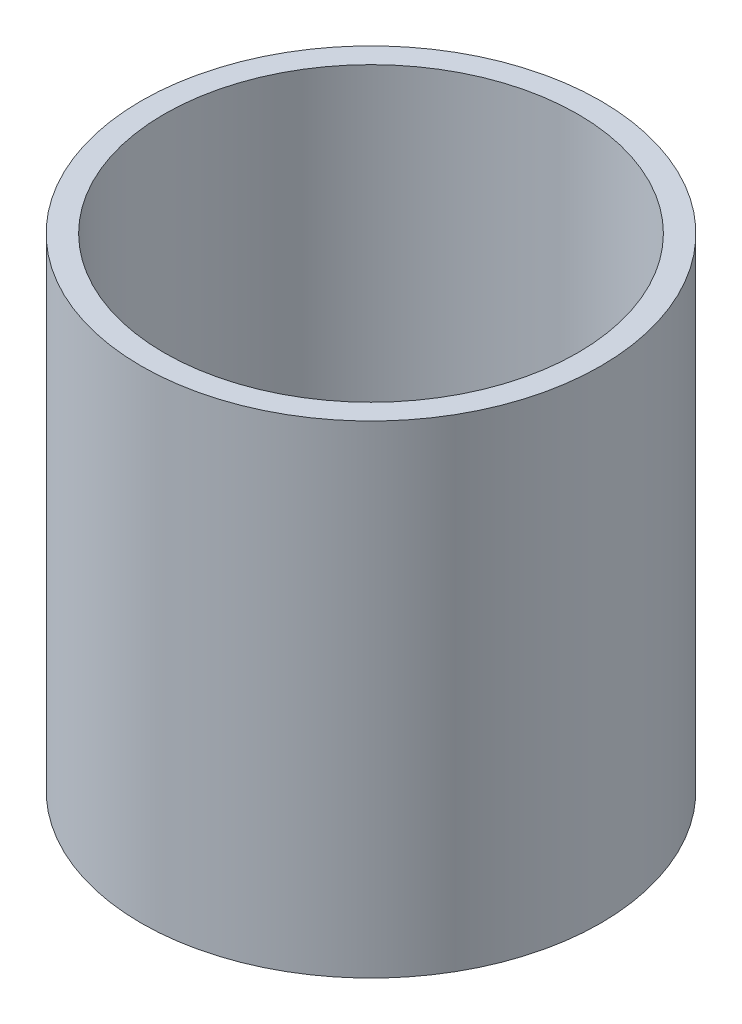
ISO-10303-21;
HEADER;
FILE_DESCRIPTION(('STEP AP214'),'2;1');
FILE_NAME('part.step','',(''),(''),'','','');
FILE_SCHEMA(('AUTOMOTIVE_DESIGN { 1 0 10303 214 1 1 1 1 }'));
ENDSEC;
DATA;
#1=APPLICATION_CONTEXT('core data for automotive mechanical design processes');
#2=APPLICATION_PROTOCOL_DEFINITION('international standard','automotive_design',2000,#1);
#3=PRODUCT_CONTEXT('',#1,'mechanical');
#4=PRODUCT('Part','Part','',(#3));
#5=PRODUCT_RELATED_PRODUCT_CATEGORY('part','',(#4));
#6=PRODUCT_DEFINITION_FORMATION('','',#4);
#7=PRODUCT_DEFINITION_CONTEXT('part definition',#1,'design');
#8=PRODUCT_DEFINITION('design','',#6,#7);
#9=PRODUCT_DEFINITION_SHAPE('','',#8);
#10=(LENGTH_UNIT() NAMED_UNIT(*) SI_UNIT(.MILLI.,.METRE.));
#11=(NAMED_UNIT(*) PLANE_ANGLE_UNIT() SI_UNIT($,.RADIAN.));
#12=(NAMED_UNIT(*) SI_UNIT($,.STERADIAN.) SOLID_ANGLE_UNIT());
#13=UNCERTAINTY_MEASURE_WITH_UNIT(LENGTH_MEASURE(1.E-05),#10,'distance_accuracy_value','');
#14=(GEOMETRIC_REPRESENTATION_CONTEXT(3) GLOBAL_UNCERTAINTY_ASSIGNED_CONTEXT((#13)) GLOBAL_UNIT_ASSIGNED_CONTEXT((#10,
#11,#12)) REPRESENTATION_CONTEXT('',''));
#15=CARTESIAN_POINT('',(0.,0.,0.));
#16=DIRECTION('',(0.,0.,1.));
#17=DIRECTION('',(1.,0.,0.));
#18=AXIS2_PLACEMENT_3D('',#15,#16,#17);
#19=CARTESIAN_POINT('',(0.,21.,0.));
#20=DIRECTION('',(0.,1.,0.));
#21=DIRECTION('',(0.,0.,1.));
#22=AXIS2_PLACEMENT_3D('',#19,#20,#21);
#23=PLANE('',#22);
#24=CARTESIAN_POINT('',(0.,21.,0.));
#25=DIRECTION('',(0.,1.,0.));
#26=DIRECTION('',(0.,0.,1.));
#27=AXIS2_PLACEMENT_3D('',#24,#25,#26);
#28=CIRCLE('',#27,10.);
#29=CARTESIAN_POINT('',(0.,21.,-10.));
#30=VERTEX_POINT('',#29);
#31=EDGE_CURVE('E10',#30,#30,#28,.T.);
#32=ORIENTED_EDGE('',*,*,#31,.T.);
#33=EDGE_LOOP('',(#32));
#34=FACE_BOUND('',#33,.T.);
#35=CARTESIAN_POINT('',(0.,21.,0.));
#36=DIRECTION('',(0.,1.,0.));
#37=DIRECTION('',(0.,0.,1.));
#38=AXIS2_PLACEMENT_3D('',#35,#36,#37);
#39=CIRCLE('',#38,9.);
#40=CARTESIAN_POINT('',(0.,21.,-9.));
#41=VERTEX_POINT('',#40);
#42=EDGE_CURVE('E50',#41,#41,#39,.T.);
#43=ORIENTED_EDGE('',*,*,#42,.F.);
#44=EDGE_LOOP('',(#43));
#45=FACE_BOUND('',#44,.T.);
#46=ADVANCED_FACE('F37',(#34,#45),#23,.T.);
#47=CARTESIAN_POINT('',(0.,0.,0.));
#48=DIRECTION('',(0.,1.,0.));
#49=DIRECTION('',(0.,0.,1.));
#50=AXIS2_PLACEMENT_3D('',#47,#48,#49);
#51=PLANE('',#50);
#52=CARTESIAN_POINT('',(0.,0.,0.));
#53=DIRECTION('',(0.,1.,0.));
#54=DIRECTION('',(0.,0.,1.));
#55=AXIS2_PLACEMENT_3D('',#52,#53,#54);
#56=CIRCLE('',#55,10.);
#57=CARTESIAN_POINT('',(0.,0.,-10.));
#58=VERTEX_POINT('',#57);
#59=EDGE_CURVE('E41',#58,#58,#56,.T.);
#60=ORIENTED_EDGE('',*,*,#59,.F.);
#61=EDGE_LOOP('',(#60));
#62=FACE_BOUND('',#61,.T.);
#63=CARTESIAN_POINT('',(0.,0.,0.));
#64=DIRECTION('',(0.,1.,0.));
#65=DIRECTION('',(0.,0.,1.));
#66=AXIS2_PLACEMENT_3D('',#63,#64,#65);
#67=CIRCLE('',#66,9.);
#68=CARTESIAN_POINT('',(0.,0.,-9.));
#69=VERTEX_POINT('',#68);
#70=EDGE_CURVE('E52',#69,#69,#67,.T.);
#71=ORIENTED_EDGE('',*,*,#70,.T.);
#72=EDGE_LOOP('',(#71));
#73=FACE_BOUND('',#72,.T.);
#74=ADVANCED_FACE('F64',(#62,#73),#51,.F.);
#75=CARTESIAN_POINT('',(0.,21.,0.));
#76=DIRECTION('',(0.,-1.,0.));
#77=DIRECTION('',(0.,0.,-1.));
#78=AXIS2_PLACEMENT_3D('',#75,#76,#77);
#79=CYLINDRICAL_SURFACE('',#78,10.);
#80=CARTESIAN_POINT('',(0.,21.,-10.));
#81=CARTESIAN_POINT('',(0.,20.78125,-10.));
#82=CARTESIAN_POINT('',(0.,20.5625,-10.));
#83=CARTESIAN_POINT('',(0.,20.125,-10.));
#84=CARTESIAN_POINT('',(0.,19.90625,-10.));
#85=CARTESIAN_POINT('',(0.,19.46875,-10.));
#86=CARTESIAN_POINT('',(0.,19.25,-10.));
#87=CARTESIAN_POINT('',(0.,18.8125,-10.));
#88=CARTESIAN_POINT('',(0.,18.59375,-10.));
#89=CARTESIAN_POINT('',(0.,18.15625,-10.));
#90=CARTESIAN_POINT('',(0.,17.9375,-10.));
#91=CARTESIAN_POINT('',(0.,17.5,-10.));
#92=CARTESIAN_POINT('',(0.,17.28125,-10.));
#93=CARTESIAN_POINT('',(0.,16.84375,-10.));
#94=CARTESIAN_POINT('',(0.,16.625,-10.));
#95=CARTESIAN_POINT('',(0.,16.1875,-10.));
#96=CARTESIAN_POINT('',(0.,15.96875,-10.));
#97=CARTESIAN_POINT('',(0.,15.53125,-10.));
#98=CARTESIAN_POINT('',(0.,15.3125,-10.));
#99=CARTESIAN_POINT('',(0.,14.875,-10.));
#100=CARTESIAN_POINT('',(0.,14.65625,-10.));
#101=CARTESIAN_POINT('',(0.,14.21875,-10.));
#102=CARTESIAN_POINT('',(0.,14.,-10.));
#103=CARTESIAN_POINT('',(0.,13.5625,-10.));
#104=CARTESIAN_POINT('',(0.,13.34375,-10.));
#105=CARTESIAN_POINT('',(0.,12.90625,-10.));
#106=CARTESIAN_POINT('',(0.,12.6875,-10.));
#107=CARTESIAN_POINT('',(0.,12.25,-10.));
#108=CARTESIAN_POINT('',(0.,12.03125,-10.));
#109=CARTESIAN_POINT('',(0.,11.59375,-10.));
#110=CARTESIAN_POINT('',(0.,11.375,-10.));
#111=CARTESIAN_POINT('',(0.,10.9375,-10.));
#112=CARTESIAN_POINT('',(0.,10.71875,-10.));
#113=CARTESIAN_POINT('',(0.,10.28125,-10.));
#114=CARTESIAN_POINT('',(0.,10.0625,-10.));
#115=CARTESIAN_POINT('',(0.,9.625,-10.));
#116=CARTESIAN_POINT('',(0.,9.40625,-10.));
#117=CARTESIAN_POINT('',(0.,8.96875,-10.));
#118=CARTESIAN_POINT('',(0.,8.75,-10.));
#119=CARTESIAN_POINT('',(0.,8.3125,-10.));
#120=CARTESIAN_POINT('',(0.,8.09375,-10.));
#121=CARTESIAN_POINT('',(0.,7.65625,-10.));
#122=CARTESIAN_POINT('',(0.,7.4375,-10.));
#123=CARTESIAN_POINT('',(0.,7.,-10.));
#124=CARTESIAN_POINT('',(0.,6.78125,-10.));
#125=CARTESIAN_POINT('',(0.,6.34375,-10.));
#126=CARTESIAN_POINT('',(0.,6.125,-10.));
#127=CARTESIAN_POINT('',(0.,5.6875,-10.));
#128=CARTESIAN_POINT('',(0.,5.46875,-10.));
#129=CARTESIAN_POINT('',(0.,5.03125,-10.));
#130=CARTESIAN_POINT('',(0.,4.8125,-10.));
#131=CARTESIAN_POINT('',(0.,4.375,-10.));
#132=CARTESIAN_POINT('',(0.,4.15625,-10.));
#133=CARTESIAN_POINT('',(0.,3.71875,-10.));
#134=CARTESIAN_POINT('',(0.,3.5,-10.));
#135=CARTESIAN_POINT('',(0.,3.0625,-10.));
#136=CARTESIAN_POINT('',(0.,2.84375,-10.));
#137=CARTESIAN_POINT('',(0.,2.40625,-10.));
#138=CARTESIAN_POINT('',(0.,2.1875,-10.));
#139=CARTESIAN_POINT('',(0.,1.75,-10.));
#140=CARTESIAN_POINT('',(0.,1.53125,-10.));
#141=CARTESIAN_POINT('',(0.,1.09375,-10.));
#142=CARTESIAN_POINT('',(0.,0.875000000000001,-10.));
#143=CARTESIAN_POINT('',(0.,0.4375,-10.));
#144=CARTESIAN_POINT('',(0.,0.21875,-10.));
#145=CARTESIAN_POINT('',(0.,0.,-10.));
#146=B_SPLINE_CURVE_WITH_KNOTS('',3,(#80,#81,#82,#83,#84,#85,#86,#87,#88,#89,#90,#91,#92,#93,
#94,#95,#96,#97,#98,#99,#100,#101,#102,#103,#104,#105,#106,#107,#108,#109,#110,#111,#112,#113,
#114,#115,#116,#117,#118,#119,#120,#121,#122,#123,#124,#125,#126,#127,#128,#129,#130,#131,#132,
#133,#134,#135,#136,#137,#138,#139,#140,#141,#142,#143,#144,#145),.UNSPECIFIED.,.F.,.F.,(4,2,2,
2,2,2,2,2,2,2,2,2,2,2,2,2,2,2,2,2,2,2,2,2,2,2,2,2,2,2,2,2,4),(0.,0.656249999999997,1.3125,
1.96875,2.625,3.28125,3.9375,4.59375,5.25,5.90625,6.5625,7.21875,7.875,8.53125,9.1875,9.84375,
10.5,11.15625,11.8125,12.46875,13.125,13.78125,14.4375,15.09375,15.75,16.40625,17.0625,17.71875,
18.375,19.03125,19.6875,20.34375,21.),.UNSPECIFIED.);
#147=EDGE_CURVE('BSEAM39',#30,#58,#146,.T.);
#148=ORIENTED_EDGE('',*,*,#31,.F.);
#149=ORIENTED_EDGE('',*,*,#59,.T.);
#150=ORIENTED_EDGE('',*,*,#147,.T.);
#151=ORIENTED_EDGE('',*,*,#147,.F.);
#152=EDGE_LOOP('',(#148,#150,#149,#151));
#153=FACE_BOUND('',#152,.T.);
#154=ADVANCED_FACE('F39',(#153),#79,.T.);
#155=CARTESIAN_POINT('',(0.,21.,0.));
#156=DIRECTION('',(0.,-1.,0.));
#157=DIRECTION('',(0.,0.,-1.));
#158=AXIS2_PLACEMENT_3D('',#155,#156,#157);
#159=CYLINDRICAL_SURFACE('',#158,9.);
#160=CARTESIAN_POINT('',(0.,21.,-9.));
#161=CARTESIAN_POINT('',(0.,20.78125,-9.));
#162=CARTESIAN_POINT('',(0.,20.5625,-9.));
#163=CARTESIAN_POINT('',(0.,20.125,-9.));
#164=CARTESIAN_POINT('',(0.,19.90625,-9.));
#165=CARTESIAN_POINT('',(0.,19.46875,-9.));
#166=CARTESIAN_POINT('',(0.,19.25,-9.));
#167=CARTESIAN_POINT('',(0.,18.8125,-9.));
#168=CARTESIAN_POINT('',(0.,18.59375,-9.));
#169=CARTESIAN_POINT('',(0.,18.15625,-9.));
#170=CARTESIAN_POINT('',(0.,17.9375,-9.));
#171=CARTESIAN_POINT('',(0.,17.5,-9.));
#172=CARTESIAN_POINT('',(0.,17.28125,-9.));
#173=CARTESIAN_POINT('',(0.,16.84375,-9.));
#174=CARTESIAN_POINT('',(0.,16.625,-9.));
#175=CARTESIAN_POINT('',(0.,16.1875,-9.));
#176=CARTESIAN_POINT('',(0.,15.96875,-9.));
#177=CARTESIAN_POINT('',(0.,15.53125,-9.));
#178=CARTESIAN_POINT('',(0.,15.3125,-9.));
#179=CARTESIAN_POINT('',(0.,14.875,-9.));
#180=CARTESIAN_POINT('',(0.,14.65625,-9.));
#181=CARTESIAN_POINT('',(0.,14.21875,-9.));
#182=CARTESIAN_POINT('',(0.,14.,-9.));
#183=CARTESIAN_POINT('',(0.,13.5625,-9.));
#184=CARTESIAN_POINT('',(0.,13.34375,-9.));
#185=CARTESIAN_POINT('',(0.,12.90625,-9.));
#186=CARTESIAN_POINT('',(0.,12.6875,-9.));
#187=CARTESIAN_POINT('',(0.,12.25,-9.));
#188=CARTESIAN_POINT('',(0.,12.03125,-9.));
#189=CARTESIAN_POINT('',(0.,11.59375,-9.));
#190=CARTESIAN_POINT('',(0.,11.375,-9.));
#191=CARTESIAN_POINT('',(0.,10.9375,-9.));
#192=CARTESIAN_POINT('',(0.,10.71875,-9.));
#193=CARTESIAN_POINT('',(0.,10.28125,-9.));
#194=CARTESIAN_POINT('',(0.,10.0625,-9.));
#195=CARTESIAN_POINT('',(0.,9.625,-9.));
#196=CARTESIAN_POINT('',(0.,9.40625,-9.));
#197=CARTESIAN_POINT('',(0.,8.96875,-9.));
#198=CARTESIAN_POINT('',(0.,8.75,-9.));
#199=CARTESIAN_POINT('',(0.,8.3125,-9.));
#200=CARTESIAN_POINT('',(0.,8.09375,-9.));
#201=CARTESIAN_POINT('',(0.,7.65625,-9.));
#202=CARTESIAN_POINT('',(0.,7.4375,-9.));
#203=CARTESIAN_POINT('',(0.,7.,-9.));
#204=CARTESIAN_POINT('',(0.,6.78125,-9.));
#205=CARTESIAN_POINT('',(0.,6.34375,-9.));
#206=CARTESIAN_POINT('',(0.,6.125,-9.));
#207=CARTESIAN_POINT('',(0.,5.6875,-9.));
#208=CARTESIAN_POINT('',(0.,5.46875,-9.));
#209=CARTESIAN_POINT('',(0.,5.03125,-9.));
#210=CARTESIAN_POINT('',(0.,4.8125,-9.));
#211=CARTESIAN_POINT('',(0.,4.375,-9.));
#212=CARTESIAN_POINT('',(0.,4.15625,-9.));
#213=CARTESIAN_POINT('',(0.,3.71875,-9.));
#214=CARTESIAN_POINT('',(0.,3.5,-9.));
#215=CARTESIAN_POINT('',(0.,3.0625,-9.));
#216=CARTESIAN_POINT('',(0.,2.84375,-9.));
#217=CARTESIAN_POINT('',(0.,2.40625,-9.));
#218=CARTESIAN_POINT('',(0.,2.1875,-9.));
#219=CARTESIAN_POINT('',(0.,1.75,-9.));
#220=CARTESIAN_POINT('',(0.,1.53125,-9.));
#221=CARTESIAN_POINT('',(0.,1.09375,-9.));
#222=CARTESIAN_POINT('',(0.,0.875000000000001,-9.));
#223=CARTESIAN_POINT('',(0.,0.4375,-9.));
#224=CARTESIAN_POINT('',(0.,0.21875,-9.));
#225=CARTESIAN_POINT('',(0.,0.,-9.));
#226=B_SPLINE_CURVE_WITH_KNOTS('',3,(#160,#161,#162,#163,#164,#165,#166,#167,#168,#169,#170,
#171,#172,#173,#174,#175,#176,#177,#178,#179,#180,#181,#182,#183,#184,#185,#186,#187,#188,#189,
#190,#191,#192,#193,#194,#195,#196,#197,#198,#199,#200,#201,#202,#203,#204,#205,#206,#207,#208,
#209,#210,#211,#212,#213,#214,#215,#216,#217,#218,#219,#220,#221,#222,#223,#224,#225),
.UNSPECIFIED.,.F.,.F.,(4,2,2,2,2,2,2,2,2,2,2,2,2,2,2,2,2,2,2,2,2,2,2,2,2,2,2,2,2,2,2,2,4),(0.,
0.656249999999997,1.3125,1.96875,2.625,3.28125,3.9375,4.59375,5.25,5.90625,6.5625,7.21875,7.875,
8.53125,9.1875,9.84375,10.5,11.15625,11.8125,12.46875,13.125,13.78125,14.4375,15.09375,15.75,
16.40625,17.0625,17.71875,18.375,19.03125,19.6875,20.34375,21.),.UNSPECIFIED.);
#227=EDGE_CURVE('BSEAM60',#41,#69,#226,.T.);
#228=ORIENTED_EDGE('',*,*,#42,.T.);
#229=ORIENTED_EDGE('',*,*,#70,.F.);
#230=ORIENTED_EDGE('',*,*,#227,.T.);
#231=ORIENTED_EDGE('',*,*,#227,.F.);
#232=EDGE_LOOP('',(#228,#230,#229,#231));
#233=FACE_BOUND('',#232,.T.);
#234=ADVANCED_FACE('F60',(#233),#159,.F.);
#235=CLOSED_SHELL('',(#46,#74,#154,#234));
#236=MANIFOLD_SOLID_BREP('B2',#235);
#237=ADVANCED_BREP_SHAPE_REPRESENTATION('',(#18,#236),#14);
#238=SHAPE_DEFINITION_REPRESENTATION(#9,#237);
ENDSEC;
END-ISO-10303-21;
